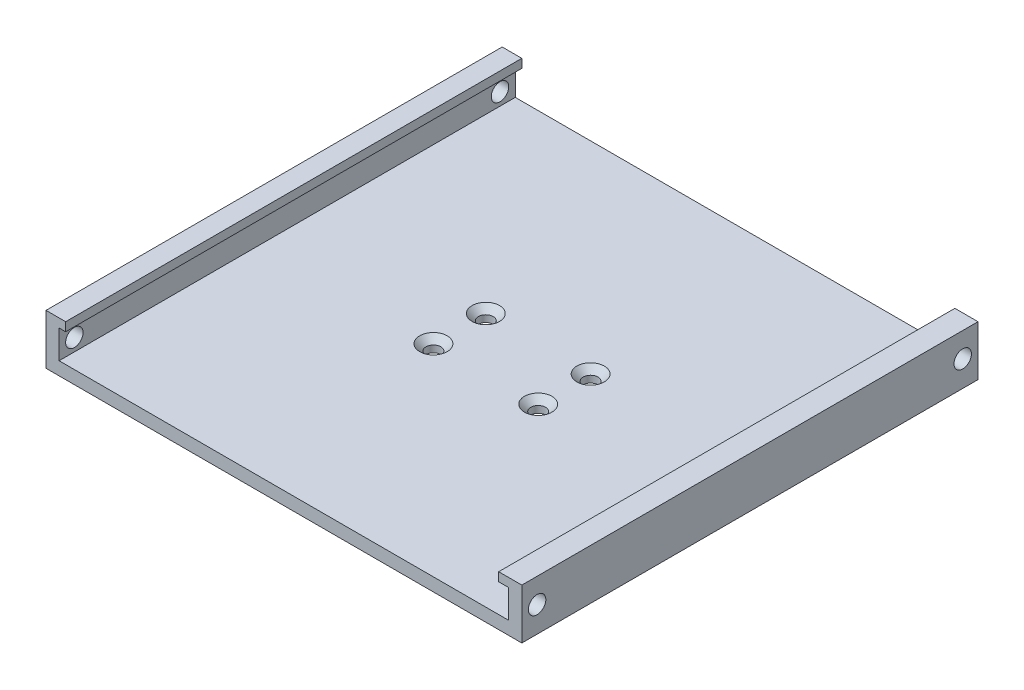
ISO-10303-21;
HEADER;
FILE_DESCRIPTION(('STEP AP214'),'2;1');
FILE_NAME('part.step','',(''),(''),'','','');
FILE_SCHEMA(('AUTOMOTIVE_DESIGN { 1 0 10303 214 1 1 1 1 }'));
ENDSEC;
DATA;
#1=APPLICATION_CONTEXT('core data for automotive mechanical design processes');
#2=APPLICATION_PROTOCOL_DEFINITION('international standard','automotive_design',2000,#1);
#3=PRODUCT_CONTEXT('',#1,'mechanical');
#4=PRODUCT('Part','Part','',(#3));
#5=PRODUCT_RELATED_PRODUCT_CATEGORY('part','',(#4));
#6=PRODUCT_DEFINITION_FORMATION('','',#4);
#7=PRODUCT_DEFINITION_CONTEXT('part definition',#1,'design');
#8=PRODUCT_DEFINITION('design','',#6,#7);
#9=PRODUCT_DEFINITION_SHAPE('','',#8);
#10=(LENGTH_UNIT() NAMED_UNIT(*) SI_UNIT(.MILLI.,.METRE.));
#11=(NAMED_UNIT(*) PLANE_ANGLE_UNIT() SI_UNIT($,.RADIAN.));
#12=(NAMED_UNIT(*) SI_UNIT($,.STERADIAN.) SOLID_ANGLE_UNIT());
#13=UNCERTAINTY_MEASURE_WITH_UNIT(LENGTH_MEASURE(1.E-05),#10,'distance_accuracy_value','');
#14=(GEOMETRIC_REPRESENTATION_CONTEXT(3) GLOBAL_UNCERTAINTY_ASSIGNED_CONTEXT((#13)) GLOBAL_UNIT_ASSIGNED_CONTEXT((#10,
#11,#12)) REPRESENTATION_CONTEXT('',''));
#15=CARTESIAN_POINT('',(0.,0.,0.));
#16=DIRECTION('',(0.,0.,1.));
#17=DIRECTION('',(1.,0.,0.));
#18=AXIS2_PLACEMENT_3D('',#15,#16,#17);
#19=CARTESIAN_POINT('',(-54.5,11.5,-52.25));
#20=DIRECTION('',(-1.,0.,0.));
#21=DIRECTION('',(0.,-1.,0.));
#22=AXIS2_PLACEMENT_3D('',#19,#20,#21);
#23=PLANE('',#22);
#24=CARTESIAN_POINT('',(-54.5,5.87500000000007,48.75));
#25=DIRECTION('',(1.,0.,0.));
#26=DIRECTION('',(0.,1.,0.));
#27=AXIS2_PLACEMENT_3D('',#24,#25,#26);
#28=CIRCLE('',#27,2.);
#29=CARTESIAN_POINT('',(-54.5,7.87500000000007,48.75));
#30=VERTEX_POINT('',#29);
#31=EDGE_CURVE('E359',#30,#30,#28,.T.);
#32=ORIENTED_EDGE('',*,*,#31,.T.);
#33=EDGE_LOOP('',(#32));
#34=FACE_BOUND('',#33,.T.);
#35=CARTESIAN_POINT('',(-54.5,5.87500000000041,-48.75));
#36=DIRECTION('',(1.,0.,0.));
#37=DIRECTION('',(0.,1.,0.));
#38=AXIS2_PLACEMENT_3D('',#35,#36,#37);
#39=CIRCLE('',#38,2.);
#40=CARTESIAN_POINT('',(-54.5,7.87500000000041,-48.75));
#41=VERTEX_POINT('',#40);
#42=EDGE_CURVE('E360',#41,#41,#39,.T.);
#43=ORIENTED_EDGE('',*,*,#42,.T.);
#44=EDGE_LOOP('',(#43));
#45=FACE_BOUND('',#44,.T.);
#46=DIRECTION('',(0.,0.,1.));
#47=VECTOR('',#46,1.);
#48=CARTESIAN_POINT('',(-54.5,0.,-52.25));
#49=LINE('',#48,#47);
#50=CARTESIAN_POINT('',(-54.5,0.,-52.25));
#51=VERTEX_POINT('',#50);
#52=CARTESIAN_POINT('',(-54.5,0.,52.25));
#53=VERTEX_POINT('',#52);
#54=EDGE_CURVE('E42',#51,#53,#49,.T.);
#55=ORIENTED_EDGE('',*,*,#54,.T.);
#56=DIRECTION('',(0.,-1.,0.));
#57=VECTOR('',#56,1.);
#58=CARTESIAN_POINT('',(-54.5,11.5,52.25));
#59=LINE('',#58,#57);
#60=CARTESIAN_POINT('',(-54.5,11.5,52.25));
#61=VERTEX_POINT('',#60);
#62=EDGE_CURVE('E127',#61,#53,#59,.T.);
#63=ORIENTED_EDGE('',*,*,#62,.F.);
#64=DIRECTION('',(0.,0.,1.));
#65=VECTOR('',#64,1.);
#66=CARTESIAN_POINT('',(-54.5,11.5,-52.25));
#67=LINE('',#66,#65);
#68=CARTESIAN_POINT('',(-54.5,11.5,-52.25));
#69=VERTEX_POINT('',#68);
#70=EDGE_CURVE('E11',#69,#61,#67,.T.);
#71=ORIENTED_EDGE('',*,*,#70,.F.);
#72=DIRECTION('',(0.,-1.,0.));
#73=VECTOR('',#72,1.);
#74=CARTESIAN_POINT('',(-54.5,11.5,-52.25));
#75=LINE('',#74,#73);
#76=EDGE_CURVE('E128',#69,#51,#75,.T.);
#77=ORIENTED_EDGE('',*,*,#76,.T.);
#78=EDGE_LOOP('',(#55,#63,#71,#77));
#79=FACE_BOUND('',#78,.T.);
#80=ADVANCED_FACE('F39',(#34,#45,#79),#23,.T.);
#81=CARTESIAN_POINT('',(-54.5,11.5,-52.25));
#82=DIRECTION('',(0.,1.,0.));
#83=DIRECTION('',(0.,0.,1.));
#84=AXIS2_PLACEMENT_3D('',#81,#82,#83);
#85=PLANE('',#84);
#86=ORIENTED_EDGE('',*,*,#70,.T.);
#87=DIRECTION('',(-1.,0.,0.));
#88=VECTOR('',#87,1.);
#89=CARTESIAN_POINT('',(-54.5,11.5,52.25));
#90=LINE('',#89,#88);
#91=CARTESIAN_POINT('',(-50.,11.5,52.25));
#92=VERTEX_POINT('',#91);
#93=EDGE_CURVE('E145',#92,#61,#90,.T.);
#94=ORIENTED_EDGE('',*,*,#93,.F.);
#95=DIRECTION('',(0.,0.,1.));
#96=VECTOR('',#95,1.);
#97=CARTESIAN_POINT('',(-50.,11.5,-52.25));
#98=LINE('',#97,#96);
#99=CARTESIAN_POINT('',(-50.,11.5,-52.25));
#100=VERTEX_POINT('',#99);
#101=EDGE_CURVE('E47',#100,#92,#98,.T.);
#102=ORIENTED_EDGE('',*,*,#101,.F.);
#103=DIRECTION('',(-1.,0.,0.));
#104=VECTOR('',#103,1.);
#105=CARTESIAN_POINT('',(-54.5,11.5,-52.25));
#106=LINE('',#105,#104);
#107=EDGE_CURVE('E133',#100,#69,#106,.T.);
#108=ORIENTED_EDGE('',*,*,#107,.T.);
#109=EDGE_LOOP('',(#86,#94,#102,#108));
#110=FACE_BOUND('',#109,.T.);
#111=ADVANCED_FACE('F262',(#110),#85,.T.);
#112=CARTESIAN_POINT('',(-50.,11.5,-52.25));
#113=DIRECTION('',(1.,0.,0.));
#114=DIRECTION('',(0.,0.,-1.));
#115=AXIS2_PLACEMENT_3D('',#112,#113,#114);
#116=PLANE('',#115);
#117=ORIENTED_EDGE('',*,*,#101,.T.);
#118=DIRECTION('',(0.,1.,0.));
#119=VECTOR('',#118,1.);
#120=CARTESIAN_POINT('',(-50.,11.5,52.25));
#121=LINE('',#120,#119);
#122=CARTESIAN_POINT('',(-50.,9.5,52.25));
#123=VERTEX_POINT('',#122);
#124=EDGE_CURVE('E175',#123,#92,#121,.T.);
#125=ORIENTED_EDGE('',*,*,#124,.F.);
#126=DIRECTION('',(0.,0.,1.));
#127=VECTOR('',#126,1.);
#128=CARTESIAN_POINT('',(-50.,9.5,-52.25));
#129=LINE('',#128,#127);
#130=CARTESIAN_POINT('',(-50.,9.5,-52.25));
#131=VERTEX_POINT('',#130);
#132=EDGE_CURVE('E209',#131,#123,#129,.T.);
#133=ORIENTED_EDGE('',*,*,#132,.F.);
#134=DIRECTION('',(0.,1.,0.));
#135=VECTOR('',#134,1.);
#136=CARTESIAN_POINT('',(-50.,11.5,-52.25));
#137=LINE('',#136,#135);
#138=EDGE_CURVE('E205',#131,#100,#137,.T.);
#139=ORIENTED_EDGE('',*,*,#138,.T.);
#140=EDGE_LOOP('',(#117,#125,#133,#139));
#141=FACE_BOUND('',#140,.T.);
#142=ADVANCED_FACE('F260',(#141),#116,.T.);
#143=CARTESIAN_POINT('',(-51.5,9.5,-52.25));
#144=DIRECTION('',(0.,-1.,0.));
#145=DIRECTION('',(0.,0.,-1.));
#146=AXIS2_PLACEMENT_3D('',#143,#144,#145);
#147=PLANE('',#146);
#148=ORIENTED_EDGE('',*,*,#132,.T.);
#149=DIRECTION('',(1.,0.,0.));
#150=VECTOR('',#149,1.);
#151=CARTESIAN_POINT('',(-51.5,9.5,52.25));
#152=LINE('',#151,#150);
#153=CARTESIAN_POINT('',(-51.5,9.5,52.25));
#154=VERTEX_POINT('',#153);
#155=EDGE_CURVE('E172',#154,#123,#152,.T.);
#156=ORIENTED_EDGE('',*,*,#155,.F.);
#157=DIRECTION('',(0.,0.,1.));
#158=VECTOR('',#157,1.);
#159=CARTESIAN_POINT('',(-51.5,9.5,-52.25));
#160=LINE('',#159,#158);
#161=CARTESIAN_POINT('',(-51.5,9.5,-52.25));
#162=VERTEX_POINT('',#161);
#163=EDGE_CURVE('E211',#162,#154,#160,.T.);
#164=ORIENTED_EDGE('',*,*,#163,.F.);
#165=DIRECTION('',(1.,0.,0.));
#166=VECTOR('',#165,1.);
#167=CARTESIAN_POINT('',(-51.5,9.5,-52.25));
#168=LINE('',#167,#166);
#169=EDGE_CURVE('E202',#162,#131,#168,.T.);
#170=ORIENTED_EDGE('',*,*,#169,.T.);
#171=EDGE_LOOP('',(#148,#156,#164,#170));
#172=FACE_BOUND('',#171,.T.);
#173=ADVANCED_FACE('F258',(#172),#147,.T.);
#174=CARTESIAN_POINT('',(-51.5,9.5,-52.25));
#175=DIRECTION('',(1.,0.,0.));
#176=DIRECTION('',(0.,0.,-1.));
#177=AXIS2_PLACEMENT_3D('',#174,#175,#176);
#178=PLANE('',#177);
#179=CARTESIAN_POINT('',(-51.5,5.87500000000007,48.75));
#180=DIRECTION('',(1.,0.,0.));
#181=DIRECTION('',(0.,0.,-1.));
#182=AXIS2_PLACEMENT_3D('',#179,#180,#181);
#183=CIRCLE('',#182,2.);
#184=CARTESIAN_POINT('',(-51.5,7.87500000000007,48.75));
#185=VERTEX_POINT('',#184);
#186=EDGE_CURVE('E347',#185,#185,#183,.T.);
#187=ORIENTED_EDGE('',*,*,#186,.F.);
#188=EDGE_LOOP('',(#187));
#189=FACE_BOUND('',#188,.T.);
#190=CARTESIAN_POINT('',(-51.5,5.87500000000041,-48.75));
#191=DIRECTION('',(1.,0.,0.));
#192=DIRECTION('',(0.,0.,-1.));
#193=AXIS2_PLACEMENT_3D('',#190,#191,#192);
#194=CIRCLE('',#193,2.);
#195=CARTESIAN_POINT('',(-51.5,7.87500000000041,-48.75));
#196=VERTEX_POINT('',#195);
#197=EDGE_CURVE('E353',#196,#196,#194,.T.);
#198=ORIENTED_EDGE('',*,*,#197,.F.);
#199=EDGE_LOOP('',(#198));
#200=FACE_BOUND('',#199,.T.);
#201=ORIENTED_EDGE('',*,*,#163,.T.);
#202=DIRECTION('',(0.,1.,0.));
#203=VECTOR('',#202,1.);
#204=CARTESIAN_POINT('',(-51.5,9.5,52.25));
#205=LINE('',#204,#203);
#206=CARTESIAN_POINT('',(-51.5,3.,52.25));
#207=VERTEX_POINT('',#206);
#208=EDGE_CURVE('E169',#207,#154,#205,.T.);
#209=ORIENTED_EDGE('',*,*,#208,.F.);
#210=DIRECTION('',(0.,0.,1.));
#211=VECTOR('',#210,1.);
#212=CARTESIAN_POINT('',(-51.5,3.,-52.25));
#213=LINE('',#212,#211);
#214=CARTESIAN_POINT('',(-51.5,3.,-52.25));
#215=VERTEX_POINT('',#214);
#216=EDGE_CURVE('E213',#215,#207,#213,.T.);
#217=ORIENTED_EDGE('',*,*,#216,.F.);
#218=DIRECTION('',(0.,1.,0.));
#219=VECTOR('',#218,1.);
#220=CARTESIAN_POINT('',(-51.5,9.5,-52.25));
#221=LINE('',#220,#219);
#222=EDGE_CURVE('E199',#215,#162,#221,.T.);
#223=ORIENTED_EDGE('',*,*,#222,.T.);
#224=EDGE_LOOP('',(#201,#209,#217,#223));
#225=FACE_BOUND('',#224,.T.);
#226=ADVANCED_FACE('F253',(#189,#200,#225),#178,.T.);
#227=CARTESIAN_POINT('',(-51.5,3.,-52.25));
#228=DIRECTION('',(0.,1.,0.));
#229=DIRECTION('',(0.,0.,1.));
#230=AXIS2_PLACEMENT_3D('',#227,#228,#229);
#231=PLANE('',#230);
#232=CARTESIAN_POINT('',(-12.,3.,-6.));
#233=DIRECTION('',(0.,1.,0.));
#234=DIRECTION('',(0.,0.,1.));
#235=AXIS2_PLACEMENT_3D('',#232,#233,#234);
#236=CIRCLE('',#235,3.15);
#237=CARTESIAN_POINT('',(-12.,3.,-2.85));
#238=VERTEX_POINT('',#237);
#239=EDGE_CURVE('E344',#238,#238,#236,.T.);
#240=ORIENTED_EDGE('',*,*,#239,.F.);
#241=EDGE_LOOP('',(#240));
#242=FACE_BOUND('',#241,.T.);
#243=CARTESIAN_POINT('',(-12.,3.,6.));
#244=DIRECTION('',(0.,1.,0.));
#245=DIRECTION('',(0.,0.,1.));
#246=AXIS2_PLACEMENT_3D('',#243,#244,#245);
#247=CIRCLE('',#246,3.15);
#248=CARTESIAN_POINT('',(-12.,3.,9.15));
#249=VERTEX_POINT('',#248);
#250=EDGE_CURVE('E337',#249,#249,#247,.T.);
#251=ORIENTED_EDGE('',*,*,#250,.F.);
#252=EDGE_LOOP('',(#251));
#253=FACE_BOUND('',#252,.T.);
#254=CARTESIAN_POINT('',(12.,3.,6.));
#255=DIRECTION('',(0.,1.,0.));
#256=DIRECTION('',(0.,0.,1.));
#257=AXIS2_PLACEMENT_3D('',#254,#255,#256);
#258=CIRCLE('',#257,3.15);
#259=CARTESIAN_POINT('',(12.,3.,9.15));
#260=VERTEX_POINT('',#259);
#261=EDGE_CURVE('E330',#260,#260,#258,.T.);
#262=ORIENTED_EDGE('',*,*,#261,.F.);
#263=EDGE_LOOP('',(#262));
#264=FACE_BOUND('',#263,.T.);
#265=CARTESIAN_POINT('',(12.,3.,-6.));
#266=DIRECTION('',(0.,1.,0.));
#267=DIRECTION('',(0.,0.,1.));
#268=AXIS2_PLACEMENT_3D('',#265,#266,#267);
#269=CIRCLE('',#268,3.15);
#270=CARTESIAN_POINT('',(12.,3.,-2.85));
#271=VERTEX_POINT('',#270);
#272=EDGE_CURVE('E322',#271,#271,#269,.T.);
#273=ORIENTED_EDGE('',*,*,#272,.F.);
#274=EDGE_LOOP('',(#273));
#275=FACE_BOUND('',#274,.T.);
#276=ORIENTED_EDGE('',*,*,#216,.T.);
#277=DIRECTION('',(-1.,0.,0.));
#278=VECTOR('',#277,1.);
#279=CARTESIAN_POINT('',(-51.5,3.,52.25));
#280=LINE('',#279,#278);
#281=CARTESIAN_POINT('',(51.5,3.,52.25));
#282=VERTEX_POINT('',#281);
#283=EDGE_CURVE('E166',#282,#207,#280,.T.);
#284=ORIENTED_EDGE('',*,*,#283,.F.);
#285=DIRECTION('',(0.,0.,1.));
#286=VECTOR('',#285,1.);
#287=CARTESIAN_POINT('',(51.5,3.,-52.25));
#288=LINE('',#287,#286);
#289=CARTESIAN_POINT('',(51.5,3.,-52.25));
#290=VERTEX_POINT('',#289);
#291=EDGE_CURVE('E215',#290,#282,#288,.T.);
#292=ORIENTED_EDGE('',*,*,#291,.F.);
#293=DIRECTION('',(-1.,0.,0.));
#294=VECTOR('',#293,1.);
#295=CARTESIAN_POINT('',(-51.5,3.,-52.25));
#296=LINE('',#295,#294);
#297=EDGE_CURVE('E196',#290,#215,#296,.T.);
#298=ORIENTED_EDGE('',*,*,#297,.T.);
#299=EDGE_LOOP('',(#276,#284,#292,#298));
#300=FACE_BOUND('',#299,.T.);
#301=ADVANCED_FACE('F248',(#242,#253,#264,#275,#300),#231,.T.);
#302=CARTESIAN_POINT('',(51.5,9.5,-52.25));
#303=DIRECTION('',(-1.,0.,0.));
#304=DIRECTION('',(0.,0.,1.));
#305=AXIS2_PLACEMENT_3D('',#302,#303,#304);
#306=PLANE('',#305);
#307=CARTESIAN_POINT('',(51.5,5.87500000000001,48.75));
#308=DIRECTION('',(-1.,0.,0.));
#309=DIRECTION('',(0.,0.,1.));
#310=AXIS2_PLACEMENT_3D('',#307,#308,#309);
#311=CIRCLE('',#310,2.);
#312=CARTESIAN_POINT('',(51.5,7.87500000000001,48.75));
#313=VERTEX_POINT('',#312);
#314=EDGE_CURVE('E350',#313,#313,#311,.T.);
#315=ORIENTED_EDGE('',*,*,#314,.F.);
#316=EDGE_LOOP('',(#315));
#317=FACE_BOUND('',#316,.T.);
#318=CARTESIAN_POINT('',(51.5,5.87500000000035,-48.75));
#319=DIRECTION('',(-1.,0.,0.));
#320=DIRECTION('',(0.,0.,1.));
#321=AXIS2_PLACEMENT_3D('',#318,#319,#320);
#322=CIRCLE('',#321,2.);
#323=CARTESIAN_POINT('',(51.5,7.87500000000035,-48.75));
#324=VERTEX_POINT('',#323);
#325=EDGE_CURVE('E356',#324,#324,#322,.T.);
#326=ORIENTED_EDGE('',*,*,#325,.F.);
#327=EDGE_LOOP('',(#326));
#328=FACE_BOUND('',#327,.T.);
#329=ORIENTED_EDGE('',*,*,#291,.T.);
#330=DIRECTION('',(0.,-1.,0.));
#331=VECTOR('',#330,1.);
#332=CARTESIAN_POINT('',(51.5,9.5,52.25));
#333=LINE('',#332,#331);
#334=CARTESIAN_POINT('',(51.5,9.5,52.25));
#335=VERTEX_POINT('',#334);
#336=EDGE_CURVE('E163',#335,#282,#333,.T.);
#337=ORIENTED_EDGE('',*,*,#336,.F.);
#338=DIRECTION('',(0.,0.,1.));
#339=VECTOR('',#338,1.);
#340=CARTESIAN_POINT('',(51.5,9.5,-52.25));
#341=LINE('',#340,#339);
#342=CARTESIAN_POINT('',(51.5,9.5,-52.25));
#343=VERTEX_POINT('',#342);
#344=EDGE_CURVE('E217',#343,#335,#341,.T.);
#345=ORIENTED_EDGE('',*,*,#344,.F.);
#346=DIRECTION('',(0.,-1.,0.));
#347=VECTOR('',#346,1.);
#348=CARTESIAN_POINT('',(51.5,9.5,-52.25));
#349=LINE('',#348,#347);
#350=EDGE_CURVE('E193',#343,#290,#349,.T.);
#351=ORIENTED_EDGE('',*,*,#350,.T.);
#352=EDGE_LOOP('',(#329,#337,#345,#351));
#353=FACE_BOUND('',#352,.T.);
#354=ADVANCED_FACE('F246',(#317,#328,#353),#306,.T.);
#355=CARTESIAN_POINT('',(49.2,9.5,-52.25));
#356=DIRECTION('',(0.,-1.,0.));
#357=DIRECTION('',(0.,0.,-1.));
#358=AXIS2_PLACEMENT_3D('',#355,#356,#357);
#359=PLANE('',#358);
#360=ORIENTED_EDGE('',*,*,#344,.T.);
#361=DIRECTION('',(1.,0.,0.));
#362=VECTOR('',#361,1.);
#363=CARTESIAN_POINT('',(49.2,9.5,52.25));
#364=LINE('',#363,#362);
#365=CARTESIAN_POINT('',(49.2,9.5,52.25));
#366=VERTEX_POINT('',#365);
#367=EDGE_CURVE('E160',#366,#335,#364,.T.);
#368=ORIENTED_EDGE('',*,*,#367,.F.);
#369=DIRECTION('',(0.,0.,1.));
#370=VECTOR('',#369,1.);
#371=CARTESIAN_POINT('',(49.2,9.5,-52.25));
#372=LINE('',#371,#370);
#373=CARTESIAN_POINT('',(49.2,9.5,-52.25));
#374=VERTEX_POINT('',#373);
#375=EDGE_CURVE('E219',#374,#366,#372,.T.);
#376=ORIENTED_EDGE('',*,*,#375,.F.);
#377=DIRECTION('',(1.,0.,0.));
#378=VECTOR('',#377,1.);
#379=CARTESIAN_POINT('',(49.2,9.5,-52.25));
#380=LINE('',#379,#378);
#381=EDGE_CURVE('E190',#374,#343,#380,.T.);
#382=ORIENTED_EDGE('',*,*,#381,.T.);
#383=EDGE_LOOP('',(#360,#368,#376,#382));
#384=FACE_BOUND('',#383,.T.);
#385=ADVANCED_FACE('F241',(#384),#359,.T.);
#386=CARTESIAN_POINT('',(49.2,11.5,-52.25));
#387=DIRECTION('',(-1.,0.,0.));
#388=DIRECTION('',(0.,-1.,0.));
#389=AXIS2_PLACEMENT_3D('',#386,#387,#388);
#390=PLANE('',#389);
#391=ORIENTED_EDGE('',*,*,#375,.T.);
#392=DIRECTION('',(0.,-1.,0.));
#393=VECTOR('',#392,1.);
#394=CARTESIAN_POINT('',(49.2,11.5,52.25));
#395=LINE('',#394,#393);
#396=CARTESIAN_POINT('',(49.2,11.5,52.25));
#397=VERTEX_POINT('',#396);
#398=EDGE_CURVE('E157',#397,#366,#395,.T.);
#399=ORIENTED_EDGE('',*,*,#398,.F.);
#400=DIRECTION('',(0.,0.,1.));
#401=VECTOR('',#400,1.);
#402=CARTESIAN_POINT('',(49.2,11.5,-52.25));
#403=LINE('',#402,#401);
#404=CARTESIAN_POINT('',(49.2,11.5,-52.25));
#405=VERTEX_POINT('',#404);
#406=EDGE_CURVE('E221',#405,#397,#403,.T.);
#407=ORIENTED_EDGE('',*,*,#406,.F.);
#408=DIRECTION('',(0.,-1.,0.));
#409=VECTOR('',#408,1.);
#410=CARTESIAN_POINT('',(49.2,11.5,-52.25));
#411=LINE('',#410,#409);
#412=EDGE_CURVE('E187',#405,#374,#411,.T.);
#413=ORIENTED_EDGE('',*,*,#412,.T.);
#414=EDGE_LOOP('',(#391,#399,#407,#413));
#415=FACE_BOUND('',#414,.T.);
#416=ADVANCED_FACE('F234',(#415),#390,.T.);
#417=CARTESIAN_POINT('',(49.2,11.5,-52.25));
#418=DIRECTION('',(0.,1.,0.));
#419=DIRECTION('',(0.,0.,1.));
#420=AXIS2_PLACEMENT_3D('',#417,#418,#419);
#421=PLANE('',#420);
#422=ORIENTED_EDGE('',*,*,#406,.T.);
#423=DIRECTION('',(-1.,0.,0.));
#424=VECTOR('',#423,1.);
#425=CARTESIAN_POINT('',(49.2,11.5,52.25));
#426=LINE('',#425,#424);
#427=CARTESIAN_POINT('',(54.5,11.5,52.25));
#428=VERTEX_POINT('',#427);
#429=EDGE_CURVE('E154',#428,#397,#426,.T.);
#430=ORIENTED_EDGE('',*,*,#429,.F.);
#431=DIRECTION('',(0.,0.,1.));
#432=VECTOR('',#431,1.);
#433=CARTESIAN_POINT('',(54.5,11.5,-52.25));
#434=LINE('',#433,#432);
#435=CARTESIAN_POINT('',(54.5,11.5,-52.25));
#436=VERTEX_POINT('',#435);
#437=EDGE_CURVE('E223',#436,#428,#434,.T.);
#438=ORIENTED_EDGE('',*,*,#437,.F.);
#439=DIRECTION('',(-1.,0.,0.));
#440=VECTOR('',#439,1.);
#441=CARTESIAN_POINT('',(49.2,11.5,-52.25));
#442=LINE('',#441,#440);
#443=EDGE_CURVE('E184',#436,#405,#442,.T.);
#444=ORIENTED_EDGE('',*,*,#443,.T.);
#445=EDGE_LOOP('',(#422,#430,#438,#444));
#446=FACE_BOUND('',#445,.T.);
#447=ADVANCED_FACE('F231',(#446),#421,.T.);
#448=CARTESIAN_POINT('',(54.5,11.5,-52.25));
#449=DIRECTION('',(1.,0.,0.));
#450=DIRECTION('',(0.,1.,0.));
#451=AXIS2_PLACEMENT_3D('',#448,#449,#450);
#452=PLANE('',#451);
#453=CARTESIAN_POINT('',(54.5,5.875,48.75));
#454=DIRECTION('',(1.,0.,0.));
#455=DIRECTION('',(0.,1.,0.));
#456=AXIS2_PLACEMENT_3D('',#453,#454,#455);
#457=CIRCLE('',#456,2.);
#458=CARTESIAN_POINT('',(54.5,7.87500000000001,48.75));
#459=VERTEX_POINT('',#458);
#460=EDGE_CURVE('E366',#459,#459,#457,.T.);
#461=ORIENTED_EDGE('',*,*,#460,.F.);
#462=EDGE_LOOP('',(#461));
#463=FACE_BOUND('',#462,.T.);
#464=CARTESIAN_POINT('',(54.5,5.87500000000035,-48.75));
#465=DIRECTION('',(1.,0.,0.));
#466=DIRECTION('',(0.,1.,0.));
#467=AXIS2_PLACEMENT_3D('',#464,#465,#466);
#468=CIRCLE('',#467,2.);
#469=CARTESIAN_POINT('',(54.5,7.87500000000035,-48.75));
#470=VERTEX_POINT('',#469);
#471=EDGE_CURVE('E363',#470,#470,#468,.T.);
#472=ORIENTED_EDGE('',*,*,#471,.F.);
#473=EDGE_LOOP('',(#472));
#474=FACE_BOUND('',#473,.T.);
#475=ORIENTED_EDGE('',*,*,#437,.T.);
#476=DIRECTION('',(0.,1.,0.));
#477=VECTOR('',#476,1.);
#478=CARTESIAN_POINT('',(54.5,11.5,52.25));
#479=LINE('',#478,#477);
#480=CARTESIAN_POINT('',(54.5,0.,52.25));
#481=VERTEX_POINT('',#480);
#482=EDGE_CURVE('E140',#481,#428,#479,.T.);
#483=ORIENTED_EDGE('',*,*,#482,.F.);
#484=DIRECTION('',(0.,0.,1.));
#485=VECTOR('',#484,1.);
#486=CARTESIAN_POINT('',(54.5,0.,-52.25));
#487=LINE('',#486,#485);
#488=CARTESIAN_POINT('',(54.5,0.,-52.25));
#489=VERTEX_POINT('',#488);
#490=EDGE_CURVE('E132',#489,#481,#487,.T.);
#491=ORIENTED_EDGE('',*,*,#490,.F.);
#492=DIRECTION('',(0.,1.,0.));
#493=VECTOR('',#492,1.);
#494=CARTESIAN_POINT('',(54.5,11.5,-52.25));
#495=LINE('',#494,#493);
#496=EDGE_CURVE('E181',#489,#436,#495,.T.);
#497=ORIENTED_EDGE('',*,*,#496,.T.);
#498=EDGE_LOOP('',(#475,#483,#491,#497));
#499=FACE_BOUND('',#498,.T.);
#500=ADVANCED_FACE('F225',(#463,#474,#499),#452,.T.);
#501=CARTESIAN_POINT('',(-54.5,0.,-52.25));
#502=DIRECTION('',(0.,-1.,0.));
#503=DIRECTION('',(0.,0.,-1.));
#504=AXIS2_PLACEMENT_3D('',#501,#502,#503);
#505=PLANE('',#504);
#506=CARTESIAN_POINT('',(-12.,0.,-6.));
#507=DIRECTION('',(0.,1.,0.));
#508=DIRECTION('',(0.,0.,1.));
#509=AXIS2_PLACEMENT_3D('',#506,#507,#508);
#510=CIRCLE('',#509,1.7);
#511=CARTESIAN_POINT('',(-12.,0.,-4.3));
#512=VERTEX_POINT('',#511);
#513=EDGE_CURVE('E303',#512,#512,#510,.T.);
#514=ORIENTED_EDGE('',*,*,#513,.T.);
#515=EDGE_LOOP('',(#514));
#516=FACE_BOUND('',#515,.T.);
#517=CARTESIAN_POINT('',(-12.,0.,6.));
#518=DIRECTION('',(0.,1.,0.));
#519=DIRECTION('',(0.,0.,1.));
#520=AXIS2_PLACEMENT_3D('',#517,#518,#519);
#521=CIRCLE('',#520,1.7);
#522=CARTESIAN_POINT('',(-12.,0.,7.7));
#523=VERTEX_POINT('',#522);
#524=EDGE_CURVE('E307',#523,#523,#521,.T.);
#525=ORIENTED_EDGE('',*,*,#524,.T.);
#526=EDGE_LOOP('',(#525));
#527=FACE_BOUND('',#526,.T.);
#528=CARTESIAN_POINT('',(12.,0.,6.));
#529=DIRECTION('',(0.,1.,0.));
#530=DIRECTION('',(0.,0.,1.));
#531=AXIS2_PLACEMENT_3D('',#528,#529,#530);
#532=CIRCLE('',#531,1.7);
#533=CARTESIAN_POINT('',(12.,0.,7.7));
#534=VERTEX_POINT('',#533);
#535=EDGE_CURVE('E311',#534,#534,#532,.T.);
#536=ORIENTED_EDGE('',*,*,#535,.T.);
#537=EDGE_LOOP('',(#536));
#538=FACE_BOUND('',#537,.T.);
#539=CARTESIAN_POINT('',(12.,0.,-6.));
#540=DIRECTION('',(0.,1.,0.));
#541=DIRECTION('',(0.,0.,1.));
#542=AXIS2_PLACEMENT_3D('',#539,#540,#541);
#543=CIRCLE('',#542,1.7);
#544=CARTESIAN_POINT('',(12.,0.,-4.3));
#545=VERTEX_POINT('',#544);
#546=EDGE_CURVE('E146',#545,#545,#543,.T.);
#547=ORIENTED_EDGE('',*,*,#546,.T.);
#548=EDGE_LOOP('',(#547));
#549=FACE_BOUND('',#548,.T.);
#550=ORIENTED_EDGE('',*,*,#490,.T.);
#551=DIRECTION('',(1.,0.,0.));
#552=VECTOR('',#551,1.);
#553=CARTESIAN_POINT('',(-54.5,0.,52.25));
#554=LINE('',#553,#552);
#555=EDGE_CURVE('E135',#53,#481,#554,.T.);
#556=ORIENTED_EDGE('',*,*,#555,.F.);
#557=ORIENTED_EDGE('',*,*,#54,.F.);
#558=DIRECTION('',(1.,0.,0.));
#559=VECTOR('',#558,1.);
#560=CARTESIAN_POINT('',(-54.5,0.,-52.25));
#561=LINE('',#560,#559);
#562=EDGE_CURVE('E179',#51,#489,#561,.T.);
#563=ORIENTED_EDGE('',*,*,#562,.T.);
#564=EDGE_LOOP('',(#550,#556,#557,#563));
#565=FACE_BOUND('',#564,.T.);
#566=ADVANCED_FACE('F136',(#516,#527,#538,#549,#565),#505,.T.);
#567=CARTESIAN_POINT('',(0.,0.,-52.25));
#568=DIRECTION('',(0.,0.,1.));
#569=DIRECTION('',(1.,0.,0.));
#570=AXIS2_PLACEMENT_3D('',#567,#568,#569);
#571=PLANE('',#570);
#572=ORIENTED_EDGE('',*,*,#76,.F.);
#573=ORIENTED_EDGE('',*,*,#107,.F.);
#574=ORIENTED_EDGE('',*,*,#138,.F.);
#575=ORIENTED_EDGE('',*,*,#169,.F.);
#576=ORIENTED_EDGE('',*,*,#222,.F.);
#577=ORIENTED_EDGE('',*,*,#297,.F.);
#578=ORIENTED_EDGE('',*,*,#350,.F.);
#579=ORIENTED_EDGE('',*,*,#381,.F.);
#580=ORIENTED_EDGE('',*,*,#412,.F.);
#581=ORIENTED_EDGE('',*,*,#443,.F.);
#582=ORIENTED_EDGE('',*,*,#496,.F.);
#583=ORIENTED_EDGE('',*,*,#562,.F.);
#584=EDGE_LOOP('',(#572,#573,#574,#575,#576,#577,#578,#579,#580,#581,#582,#583));
#585=FACE_BOUND('',#584,.T.);
#586=ADVANCED_FACE('F237',(#585),#571,.F.);
#587=CARTESIAN_POINT('',(0.,0.,52.25));
#588=DIRECTION('',(0.,0.,1.));
#589=DIRECTION('',(1.,0.,0.));
#590=AXIS2_PLACEMENT_3D('',#587,#588,#589);
#591=PLANE('',#590);
#592=ORIENTED_EDGE('',*,*,#62,.T.);
#593=ORIENTED_EDGE('',*,*,#555,.T.);
#594=ORIENTED_EDGE('',*,*,#482,.T.);
#595=ORIENTED_EDGE('',*,*,#429,.T.);
#596=ORIENTED_EDGE('',*,*,#398,.T.);
#597=ORIENTED_EDGE('',*,*,#367,.T.);
#598=ORIENTED_EDGE('',*,*,#336,.T.);
#599=ORIENTED_EDGE('',*,*,#283,.T.);
#600=ORIENTED_EDGE('',*,*,#208,.T.);
#601=ORIENTED_EDGE('',*,*,#155,.T.);
#602=ORIENTED_EDGE('',*,*,#124,.T.);
#603=ORIENTED_EDGE('',*,*,#93,.T.);
#604=EDGE_LOOP('',(#592,#593,#594,#595,#596,#597,#598,#599,#600,#601,#602,#603));
#605=FACE_BOUND('',#604,.T.);
#606=ADVANCED_FACE('F143',(#605),#591,.T.);
#607=CARTESIAN_POINT('',(12.,3.,-6.));
#608=DIRECTION('',(0.,1.,0.));
#609=DIRECTION('',(0.,0.,1.));
#610=AXIS2_PLACEMENT_3D('',#607,#608,#609);
#611=CYLINDRICAL_SURFACE('',#610,1.7);
#612=ORIENTED_EDGE('',*,*,#546,.F.);
#613=EDGE_LOOP('',(#612));
#614=FACE_BOUND('',#613,.T.);
#615=CARTESIAN_POINT('',(12.,1.55,-6.));
#616=DIRECTION('',(0.,1.,0.));
#617=DIRECTION('',(0.,0.,1.));
#618=AXIS2_PLACEMENT_3D('',#615,#616,#617);
#619=CIRCLE('',#618,1.7);
#620=CARTESIAN_POINT('',(12.,1.55,-4.3));
#621=VERTEX_POINT('',#620);
#622=EDGE_CURVE('E149',#621,#621,#619,.T.);
#623=ORIENTED_EDGE('',*,*,#622,.T.);
#624=EDGE_LOOP('',(#623));
#625=FACE_BOUND('',#624,.T.);
#626=ADVANCED_FACE('F314',(#614,#625),#611,.F.);
#627=CARTESIAN_POINT('',(12.,3.,-6.));
#628=DIRECTION('',(0.,1.,0.));
#629=DIRECTION('',(0.,0.,1.));
#630=AXIS2_PLACEMENT_3D('',#627,#628,#629);
#631=CONICAL_SURFACE('',#630,3.15,0.785398163397448);
#632=ORIENTED_EDGE('',*,*,#622,.F.);
#633=EDGE_LOOP('',(#632));
#634=FACE_BOUND('',#633,.T.);
#635=ORIENTED_EDGE('',*,*,#272,.T.);
#636=EDGE_LOOP('',(#635));
#637=FACE_BOUND('',#636,.T.);
#638=ADVANCED_FACE('F317',(#634,#637),#631,.F.);
#639=CARTESIAN_POINT('',(12.,3.,6.));
#640=DIRECTION('',(0.,1.,0.));
#641=DIRECTION('',(0.,0.,1.));
#642=AXIS2_PLACEMENT_3D('',#639,#640,#641);
#643=CYLINDRICAL_SURFACE('',#642,1.7);
#644=ORIENTED_EDGE('',*,*,#535,.F.);
#645=EDGE_LOOP('',(#644));
#646=FACE_BOUND('',#645,.T.);
#647=CARTESIAN_POINT('',(12.,1.55,6.));
#648=DIRECTION('',(0.,1.,0.));
#649=DIRECTION('',(0.,0.,1.));
#650=AXIS2_PLACEMENT_3D('',#647,#648,#649);
#651=CIRCLE('',#650,1.7);
#652=CARTESIAN_POINT('',(12.,1.55,7.7));
#653=VERTEX_POINT('',#652);
#654=EDGE_CURVE('E327',#653,#653,#651,.T.);
#655=ORIENTED_EDGE('',*,*,#654,.T.);
#656=EDGE_LOOP('',(#655));
#657=FACE_BOUND('',#656,.T.);
#658=ADVANCED_FACE('F421',(#646,#657),#643,.F.);
#659=CARTESIAN_POINT('',(12.,3.,6.));
#660=DIRECTION('',(0.,1.,0.));
#661=DIRECTION('',(0.,0.,1.));
#662=AXIS2_PLACEMENT_3D('',#659,#660,#661);
#663=CONICAL_SURFACE('',#662,3.15,0.785398163397448);
#664=ORIENTED_EDGE('',*,*,#654,.F.);
#665=EDGE_LOOP('',(#664));
#666=FACE_BOUND('',#665,.T.);
#667=ORIENTED_EDGE('',*,*,#261,.T.);
#668=EDGE_LOOP('',(#667));
#669=FACE_BOUND('',#668,.T.);
#670=ADVANCED_FACE('F417',(#666,#669),#663,.F.);
#671=CARTESIAN_POINT('',(-12.,3.,6.));
#672=DIRECTION('',(0.,1.,0.));
#673=DIRECTION('',(0.,0.,1.));
#674=AXIS2_PLACEMENT_3D('',#671,#672,#673);
#675=CYLINDRICAL_SURFACE('',#674,1.7);
#676=ORIENTED_EDGE('',*,*,#524,.F.);
#677=EDGE_LOOP('',(#676));
#678=FACE_BOUND('',#677,.T.);
#679=CARTESIAN_POINT('',(-12.,1.55,6.));
#680=DIRECTION('',(0.,1.,0.));
#681=DIRECTION('',(0.,0.,1.));
#682=AXIS2_PLACEMENT_3D('',#679,#680,#681);
#683=CIRCLE('',#682,1.7);
#684=CARTESIAN_POINT('',(-12.,1.55,7.7));
#685=VERTEX_POINT('',#684);
#686=EDGE_CURVE('E334',#685,#685,#683,.T.);
#687=ORIENTED_EDGE('',*,*,#686,.T.);
#688=EDGE_LOOP('',(#687));
#689=FACE_BOUND('',#688,.T.);
#690=ADVANCED_FACE('F413',(#678,#689),#675,.F.);
#691=CARTESIAN_POINT('',(-12.,3.,6.));
#692=DIRECTION('',(0.,1.,0.));
#693=DIRECTION('',(0.,0.,1.));
#694=AXIS2_PLACEMENT_3D('',#691,#692,#693);
#695=CONICAL_SURFACE('',#694,3.15,0.785398163397448);
#696=ORIENTED_EDGE('',*,*,#686,.F.);
#697=EDGE_LOOP('',(#696));
#698=FACE_BOUND('',#697,.T.);
#699=ORIENTED_EDGE('',*,*,#250,.T.);
#700=EDGE_LOOP('',(#699));
#701=FACE_BOUND('',#700,.T.);
#702=ADVANCED_FACE('F409',(#698,#701),#695,.F.);
#703=CARTESIAN_POINT('',(-12.,3.,-6.));
#704=DIRECTION('',(0.,1.,0.));
#705=DIRECTION('',(0.,0.,1.));
#706=AXIS2_PLACEMENT_3D('',#703,#704,#705);
#707=CYLINDRICAL_SURFACE('',#706,1.7);
#708=ORIENTED_EDGE('',*,*,#513,.F.);
#709=EDGE_LOOP('',(#708));
#710=FACE_BOUND('',#709,.T.);
#711=CARTESIAN_POINT('',(-12.,1.55,-6.));
#712=DIRECTION('',(0.,1.,0.));
#713=DIRECTION('',(0.,0.,1.));
#714=AXIS2_PLACEMENT_3D('',#711,#712,#713);
#715=CIRCLE('',#714,1.7);
#716=CARTESIAN_POINT('',(-12.,1.55,-4.3));
#717=VERTEX_POINT('',#716);
#718=EDGE_CURVE('E341',#717,#717,#715,.T.);
#719=ORIENTED_EDGE('',*,*,#718,.T.);
#720=EDGE_LOOP('',(#719));
#721=FACE_BOUND('',#720,.T.);
#722=ADVANCED_FACE('F403',(#710,#721),#707,.F.);
#723=CARTESIAN_POINT('',(-12.,3.,-6.));
#724=DIRECTION('',(0.,1.,0.));
#725=DIRECTION('',(0.,0.,1.));
#726=AXIS2_PLACEMENT_3D('',#723,#724,#725);
#727=CONICAL_SURFACE('',#726,3.15,0.785398163397448);
#728=ORIENTED_EDGE('',*,*,#718,.F.);
#729=EDGE_LOOP('',(#728));
#730=FACE_BOUND('',#729,.T.);
#731=ORIENTED_EDGE('',*,*,#239,.T.);
#732=EDGE_LOOP('',(#731));
#733=FACE_BOUND('',#732,.T.);
#734=ADVANCED_FACE('F390',(#730,#733),#727,.F.);
#735=CARTESIAN_POINT('',(-54.5,5.87500000000041,-48.75));
#736=DIRECTION('',(1.,0.,0.));
#737=DIRECTION('',(0.,1.,0.));
#738=AXIS2_PLACEMENT_3D('',#735,#736,#737);
#739=CYLINDRICAL_SURFACE('',#738,2.);
#740=CARTESIAN_POINT('',(51.5,7.87500000000035,-48.75));
#741=CARTESIAN_POINT('',(51.53125,7.87500000000035,-48.75));
#742=CARTESIAN_POINT('',(51.5625,7.87500000000035,-48.75));
#743=CARTESIAN_POINT('',(51.625,7.87500000000035,-48.75));
#744=CARTESIAN_POINT('',(51.65625,7.87500000000035,-48.75));
#745=CARTESIAN_POINT('',(51.71875,7.87500000000035,-48.75));
#746=CARTESIAN_POINT('',(51.75,7.87500000000035,-48.75));
#747=CARTESIAN_POINT('',(51.8125,7.87500000000035,-48.75));
#748=CARTESIAN_POINT('',(51.84375,7.87500000000035,-48.75));
#749=CARTESIAN_POINT('',(51.90625,7.87500000000035,-48.75));
#750=CARTESIAN_POINT('',(51.9375,7.87500000000035,-48.75));
#751=CARTESIAN_POINT('',(52.,7.87500000000035,-48.75));
#752=CARTESIAN_POINT('',(52.03125,7.87500000000035,-48.75));
#753=CARTESIAN_POINT('',(52.09375,7.87500000000035,-48.75));
#754=CARTESIAN_POINT('',(52.125,7.87500000000035,-48.75));
#755=CARTESIAN_POINT('',(52.1875,7.87500000000035,-48.75));
#756=CARTESIAN_POINT('',(52.21875,7.87500000000035,-48.75));
#757=CARTESIAN_POINT('',(52.28125,7.87500000000035,-48.75));
#758=CARTESIAN_POINT('',(52.3125,7.87500000000035,-48.75));
#759=CARTESIAN_POINT('',(52.375,7.87500000000035,-48.75));
#760=CARTESIAN_POINT('',(52.40625,7.87500000000035,-48.75));
#761=CARTESIAN_POINT('',(52.46875,7.87500000000035,-48.75));
#762=CARTESIAN_POINT('',(52.5,7.87500000000035,-48.75));
#763=CARTESIAN_POINT('',(52.5625,7.87500000000035,-48.75));
#764=CARTESIAN_POINT('',(52.59375,7.87500000000035,-48.75));
#765=CARTESIAN_POINT('',(52.65625,7.87500000000035,-48.75));
#766=CARTESIAN_POINT('',(52.6875,7.87500000000035,-48.75));
#767=CARTESIAN_POINT('',(52.75,7.87500000000035,-48.75));
#768=CARTESIAN_POINT('',(52.78125,7.87500000000035,-48.75));
#769=CARTESIAN_POINT('',(52.84375,7.87500000000035,-48.75));
#770=CARTESIAN_POINT('',(52.875,7.87500000000035,-48.75));
#771=CARTESIAN_POINT('',(52.9375,7.87500000000035,-48.75));
#772=CARTESIAN_POINT('',(52.96875,7.87500000000035,-48.75));
#773=CARTESIAN_POINT('',(53.03125,7.87500000000035,-48.75));
#774=CARTESIAN_POINT('',(53.0625,7.87500000000035,-48.75));
#775=CARTESIAN_POINT('',(53.125,7.87500000000035,-48.75));
#776=CARTESIAN_POINT('',(53.15625,7.87500000000035,-48.75));
#777=CARTESIAN_POINT('',(53.21875,7.87500000000035,-48.75));
#778=CARTESIAN_POINT('',(53.25,7.87500000000035,-48.75));
#779=CARTESIAN_POINT('',(53.3125,7.87500000000035,-48.75));
#780=CARTESIAN_POINT('',(53.34375,7.87500000000035,-48.75));
#781=CARTESIAN_POINT('',(53.40625,7.87500000000035,-48.75));
#782=CARTESIAN_POINT('',(53.4375,7.87500000000035,-48.75));
#783=CARTESIAN_POINT('',(53.5,7.87500000000035,-48.75));
#784=CARTESIAN_POINT('',(53.53125,7.87500000000035,-48.75));
#785=CARTESIAN_POINT('',(53.59375,7.87500000000035,-48.75));
#786=CARTESIAN_POINT('',(53.625,7.87500000000035,-48.75));
#787=CARTESIAN_POINT('',(53.6875,7.87500000000035,-48.75));
#788=CARTESIAN_POINT('',(53.71875,7.87500000000035,-48.75));
#789=CARTESIAN_POINT('',(53.78125,7.87500000000035,-48.75));
#790=CARTESIAN_POINT('',(53.8125,7.87500000000035,-48.75));
#791=CARTESIAN_POINT('',(53.875,7.87500000000035,-48.75));
#792=CARTESIAN_POINT('',(53.90625,7.87500000000035,-48.75));
#793=CARTESIAN_POINT('',(53.96875,7.87500000000035,-48.75));
#794=CARTESIAN_POINT('',(54.,7.87500000000035,-48.75));
#795=CARTESIAN_POINT('',(54.0625,7.87500000000035,-48.75));
#796=CARTESIAN_POINT('',(54.09375,7.87500000000035,-48.75));
#797=CARTESIAN_POINT('',(54.15625,7.87500000000035,-48.75));
#798=CARTESIAN_POINT('',(54.1875,7.87500000000035,-48.75));
#799=CARTESIAN_POINT('',(54.25,7.87500000000035,-48.75));
#800=CARTESIAN_POINT('',(54.28125,7.87500000000035,-48.75));
#801=CARTESIAN_POINT('',(54.34375,7.87500000000035,-48.75));
#802=CARTESIAN_POINT('',(54.375,7.87500000000035,-48.75));
#803=CARTESIAN_POINT('',(54.4375,7.87500000000035,-48.75));
#804=CARTESIAN_POINT('',(54.46875,7.87500000000035,-48.75));
#805=CARTESIAN_POINT('',(54.5,7.87500000000035,-48.75));
#806=B_SPLINE_CURVE_WITH_KNOTS('',3,(#740,#741,#742,#743,#744,#745,#746,#747,#748,#749,#750,
#751,#752,#753,#754,#755,#756,#757,#758,#759,#760,#761,#762,#763,#764,#765,#766,#767,#768,#769,
#770,#771,#772,#773,#774,#775,#776,#777,#778,#779,#780,#781,#782,#783,#784,#785,#786,#787,#788,
#789,#790,#791,#792,#793,#794,#795,#796,#797,#798,#799,#800,#801,#802,#803,#804,#805),
.UNSPECIFIED.,.F.,.F.,(4,2,2,2,2,2,2,2,2,2,2,2,2,2,2,2,2,2,2,2,2,2,2,2,2,2,2,2,2,2,2,2,4),(0.,
0.0937500000000036,0.187500000000007,0.281249999999997,0.375,0.468750000000004,
0.562499999999994,0.656249999999997,0.750000000000001,0.843750000000004,0.937500000000008,
1.03125,1.125,1.21875,1.31249999999999,1.40625,1.5,1.59375,1.68750000000001,1.78125,1.875,
1.96875000000001,2.06249999999999,2.15625,2.25,2.34375000000001,2.43750000000001,2.53125,2.625,
2.71875000000001,2.8125,2.90625,3.),.UNSPECIFIED.);
#807=EDGE_CURVE('BSEAM384',#324,#470,#806,.T.);
#808=ORIENTED_EDGE('',*,*,#325,.T.);
#809=ORIENTED_EDGE('',*,*,#471,.T.);
#810=ORIENTED_EDGE('',*,*,#807,.T.);
#811=ORIENTED_EDGE('',*,*,#807,.F.);
#812=EDGE_LOOP('',(#808,#810,#809,#811));
#813=FACE_BOUND('',#812,.T.);
#814=ADVANCED_FACE('F384',(#813),#739,.F.);
#815=CARTESIAN_POINT('',(-54.5,5.87500000000007,48.75));
#816=DIRECTION('',(1.,0.,0.));
#817=DIRECTION('',(0.,1.,0.));
#818=AXIS2_PLACEMENT_3D('',#815,#816,#817);
#819=CYLINDRICAL_SURFACE('',#818,2.);
#820=CARTESIAN_POINT('',(51.5,7.87500000000001,48.75));
#821=CARTESIAN_POINT('',(51.53125,7.87500000000001,48.75));
#822=CARTESIAN_POINT('',(51.5625,7.87500000000001,48.75));
#823=CARTESIAN_POINT('',(51.625,7.87500000000001,48.75));
#824=CARTESIAN_POINT('',(51.65625,7.87500000000001,48.75));
#825=CARTESIAN_POINT('',(51.71875,7.87500000000001,48.75));
#826=CARTESIAN_POINT('',(51.75,7.87500000000001,48.75));
#827=CARTESIAN_POINT('',(51.8125,7.87500000000001,48.75));
#828=CARTESIAN_POINT('',(51.84375,7.87500000000001,48.75));
#829=CARTESIAN_POINT('',(51.90625,7.87500000000001,48.75));
#830=CARTESIAN_POINT('',(51.9375,7.87500000000001,48.75));
#831=CARTESIAN_POINT('',(52.,7.87500000000001,48.75));
#832=CARTESIAN_POINT('',(52.03125,7.87500000000001,48.75));
#833=CARTESIAN_POINT('',(52.09375,7.87500000000001,48.75));
#834=CARTESIAN_POINT('',(52.125,7.87500000000001,48.75));
#835=CARTESIAN_POINT('',(52.1875,7.87500000000001,48.75));
#836=CARTESIAN_POINT('',(52.21875,7.87500000000001,48.75));
#837=CARTESIAN_POINT('',(52.28125,7.87500000000001,48.75));
#838=CARTESIAN_POINT('',(52.3125,7.87500000000001,48.75));
#839=CARTESIAN_POINT('',(52.375,7.87500000000001,48.75));
#840=CARTESIAN_POINT('',(52.40625,7.87500000000001,48.75));
#841=CARTESIAN_POINT('',(52.46875,7.87500000000001,48.75));
#842=CARTESIAN_POINT('',(52.5,7.87500000000001,48.75));
#843=CARTESIAN_POINT('',(52.5625,7.87500000000001,48.75));
#844=CARTESIAN_POINT('',(52.59375,7.87500000000001,48.75));
#845=CARTESIAN_POINT('',(52.65625,7.87500000000001,48.75));
#846=CARTESIAN_POINT('',(52.6875,7.87500000000001,48.75));
#847=CARTESIAN_POINT('',(52.75,7.87500000000001,48.75));
#848=CARTESIAN_POINT('',(52.78125,7.87500000000001,48.75));
#849=CARTESIAN_POINT('',(52.84375,7.87500000000001,48.75));
#850=CARTESIAN_POINT('',(52.875,7.87500000000001,48.75));
#851=CARTESIAN_POINT('',(52.9375,7.87500000000001,48.75));
#852=CARTESIAN_POINT('',(52.96875,7.87500000000001,48.75));
#853=CARTESIAN_POINT('',(53.03125,7.87500000000001,48.75));
#854=CARTESIAN_POINT('',(53.0625,7.87500000000001,48.75));
#855=CARTESIAN_POINT('',(53.125,7.87500000000001,48.75));
#856=CARTESIAN_POINT('',(53.15625,7.87500000000001,48.75));
#857=CARTESIAN_POINT('',(53.21875,7.87500000000001,48.75));
#858=CARTESIAN_POINT('',(53.25,7.87500000000001,48.75));
#859=CARTESIAN_POINT('',(53.3125,7.87500000000001,48.75));
#860=CARTESIAN_POINT('',(53.34375,7.87500000000001,48.75));
#861=CARTESIAN_POINT('',(53.40625,7.87500000000001,48.75));
#862=CARTESIAN_POINT('',(53.4375,7.87500000000001,48.75));
#863=CARTESIAN_POINT('',(53.5,7.87500000000001,48.75));
#864=CARTESIAN_POINT('',(53.53125,7.87500000000001,48.75));
#865=CARTESIAN_POINT('',(53.59375,7.87500000000001,48.75));
#866=CARTESIAN_POINT('',(53.625,7.87500000000001,48.75));
#867=CARTESIAN_POINT('',(53.6875,7.87500000000001,48.75));
#868=CARTESIAN_POINT('',(53.71875,7.87500000000001,48.75));
#869=CARTESIAN_POINT('',(53.78125,7.87500000000001,48.75));
#870=CARTESIAN_POINT('',(53.8125,7.87500000000001,48.75));
#871=CARTESIAN_POINT('',(53.875,7.87500000000001,48.75));
#872=CARTESIAN_POINT('',(53.90625,7.87500000000001,48.75));
#873=CARTESIAN_POINT('',(53.96875,7.87500000000001,48.75));
#874=CARTESIAN_POINT('',(54.,7.87500000000001,48.75));
#875=CARTESIAN_POINT('',(54.0625,7.87500000000001,48.75));
#876=CARTESIAN_POINT('',(54.09375,7.87500000000001,48.75));
#877=CARTESIAN_POINT('',(54.15625,7.87500000000001,48.75));
#878=CARTESIAN_POINT('',(54.1875,7.87500000000001,48.75));
#879=CARTESIAN_POINT('',(54.25,7.87500000000001,48.75));
#880=CARTESIAN_POINT('',(54.28125,7.87500000000001,48.75));
#881=CARTESIAN_POINT('',(54.34375,7.87500000000001,48.75));
#882=CARTESIAN_POINT('',(54.375,7.87500000000001,48.75));
#883=CARTESIAN_POINT('',(54.4375,7.87500000000001,48.75));
#884=CARTESIAN_POINT('',(54.46875,7.87500000000001,48.75));
#885=CARTESIAN_POINT('',(54.5,7.87500000000001,48.75));
#886=B_SPLINE_CURVE_WITH_KNOTS('',3,(#820,#821,#822,#823,#824,#825,#826,#827,#828,#829,#830,
#831,#832,#833,#834,#835,#836,#837,#838,#839,#840,#841,#842,#843,#844,#845,#846,#847,#848,#849,
#850,#851,#852,#853,#854,#855,#856,#857,#858,#859,#860,#861,#862,#863,#864,#865,#866,#867,#868,
#869,#870,#871,#872,#873,#874,#875,#876,#877,#878,#879,#880,#881,#882,#883,#884,#885),
.UNSPECIFIED.,.F.,.F.,(4,2,2,2,2,2,2,2,2,2,2,2,2,2,2,2,2,2,2,2,2,2,2,2,2,2,2,2,2,2,2,2,4),(0.,
0.0937500000000036,0.187500000000007,0.281249999999997,0.375,0.468750000000004,
0.562499999999994,0.656249999999997,0.750000000000001,0.843750000000004,0.937500000000008,
1.03125,1.125,1.21875,1.31249999999999,1.40625,1.5,1.59375,1.68750000000001,1.78125,1.875,
1.96875000000001,2.06249999999999,2.15625,2.25,2.34375000000001,2.43750000000001,2.53125,2.625,
2.71875000000001,2.8125,2.90625,3.),.UNSPECIFIED.);
#887=EDGE_CURVE('BSEAM378',#313,#459,#886,.T.);
#888=ORIENTED_EDGE('',*,*,#314,.T.);
#889=ORIENTED_EDGE('',*,*,#460,.T.);
#890=ORIENTED_EDGE('',*,*,#887,.T.);
#891=ORIENTED_EDGE('',*,*,#887,.F.);
#892=EDGE_LOOP('',(#888,#890,#889,#891));
#893=FACE_BOUND('',#892,.T.);
#894=ADVANCED_FACE('F378',(#893),#819,.F.);
#895=CARTESIAN_POINT('',(-51.5,7.87500000000041,-48.75));
#896=CARTESIAN_POINT('',(-51.53125,7.87500000000041,-48.75));
#897=CARTESIAN_POINT('',(-51.5625,7.87500000000041,-48.75));
#898=CARTESIAN_POINT('',(-51.625,7.87500000000041,-48.75));
#899=CARTESIAN_POINT('',(-51.65625,7.87500000000041,-48.75));
#900=CARTESIAN_POINT('',(-51.71875,7.87500000000041,-48.75));
#901=CARTESIAN_POINT('',(-51.75,7.87500000000041,-48.75));
#902=CARTESIAN_POINT('',(-51.8125,7.87500000000041,-48.75));
#903=CARTESIAN_POINT('',(-51.84375,7.87500000000041,-48.75));
#904=CARTESIAN_POINT('',(-51.90625,7.87500000000041,-48.75));
#905=CARTESIAN_POINT('',(-51.9375,7.87500000000041,-48.75));
#906=CARTESIAN_POINT('',(-52.,7.87500000000041,-48.75));
#907=CARTESIAN_POINT('',(-52.03125,7.87500000000041,-48.75));
#908=CARTESIAN_POINT('',(-52.09375,7.87500000000041,-48.75));
#909=CARTESIAN_POINT('',(-52.125,7.87500000000041,-48.75));
#910=CARTESIAN_POINT('',(-52.1875,7.87500000000041,-48.75));
#911=CARTESIAN_POINT('',(-52.21875,7.87500000000041,-48.75));
#912=CARTESIAN_POINT('',(-52.28125,7.87500000000041,-48.75));
#913=CARTESIAN_POINT('',(-52.3125,7.87500000000041,-48.75));
#914=CARTESIAN_POINT('',(-52.375,7.87500000000041,-48.75));
#915=CARTESIAN_POINT('',(-52.40625,7.87500000000041,-48.75));
#916=CARTESIAN_POINT('',(-52.46875,7.87500000000041,-48.75));
#917=CARTESIAN_POINT('',(-52.5,7.87500000000041,-48.75));
#918=CARTESIAN_POINT('',(-52.5625,7.87500000000041,-48.75));
#919=CARTESIAN_POINT('',(-52.59375,7.87500000000041,-48.75));
#920=CARTESIAN_POINT('',(-52.65625,7.87500000000041,-48.75));
#921=CARTESIAN_POINT('',(-52.6875,7.87500000000041,-48.75));
#922=CARTESIAN_POINT('',(-52.75,7.87500000000041,-48.75));
#923=CARTESIAN_POINT('',(-52.78125,7.87500000000041,-48.75));
#924=CARTESIAN_POINT('',(-52.84375,7.87500000000041,-48.75));
#925=CARTESIAN_POINT('',(-52.875,7.87500000000041,-48.75));
#926=CARTESIAN_POINT('',(-52.9375,7.87500000000041,-48.75));
#927=CARTESIAN_POINT('',(-52.96875,7.87500000000041,-48.75));
#928=CARTESIAN_POINT('',(-53.03125,7.87500000000041,-48.75));
#929=CARTESIAN_POINT('',(-53.0625,7.87500000000041,-48.75));
#930=CARTESIAN_POINT('',(-53.125,7.87500000000041,-48.75));
#931=CARTESIAN_POINT('',(-53.15625,7.87500000000041,-48.75));
#932=CARTESIAN_POINT('',(-53.21875,7.87500000000041,-48.75));
#933=CARTESIAN_POINT('',(-53.25,7.87500000000041,-48.75));
#934=CARTESIAN_POINT('',(-53.3125,7.87500000000041,-48.75));
#935=CARTESIAN_POINT('',(-53.34375,7.87500000000041,-48.75));
#936=CARTESIAN_POINT('',(-53.40625,7.87500000000041,-48.75));
#937=CARTESIAN_POINT('',(-53.4375,7.87500000000041,-48.75));
#938=CARTESIAN_POINT('',(-53.5,7.87500000000041,-48.75));
#939=CARTESIAN_POINT('',(-53.53125,7.87500000000041,-48.75));
#940=CARTESIAN_POINT('',(-53.59375,7.87500000000041,-48.75));
#941=CARTESIAN_POINT('',(-53.625,7.87500000000041,-48.75));
#942=CARTESIAN_POINT('',(-53.6875,7.87500000000041,-48.75));
#943=CARTESIAN_POINT('',(-53.71875,7.87500000000041,-48.75));
#944=CARTESIAN_POINT('',(-53.78125,7.87500000000041,-48.75));
#945=CARTESIAN_POINT('',(-53.8125,7.87500000000041,-48.75));
#946=CARTESIAN_POINT('',(-53.875,7.87500000000041,-48.75));
#947=CARTESIAN_POINT('',(-53.90625,7.87500000000041,-48.75));
#948=CARTESIAN_POINT('',(-53.96875,7.87500000000041,-48.75));
#949=CARTESIAN_POINT('',(-54.,7.87500000000041,-48.75));
#950=CARTESIAN_POINT('',(-54.0625,7.87500000000041,-48.75));
#951=CARTESIAN_POINT('',(-54.09375,7.87500000000041,-48.75));
#952=CARTESIAN_POINT('',(-54.15625,7.87500000000041,-48.75));
#953=CARTESIAN_POINT('',(-54.1875,7.87500000000041,-48.75));
#954=CARTESIAN_POINT('',(-54.25,7.87500000000041,-48.75));
#955=CARTESIAN_POINT('',(-54.28125,7.87500000000041,-48.75));
#956=CARTESIAN_POINT('',(-54.34375,7.87500000000041,-48.75));
#957=CARTESIAN_POINT('',(-54.375,7.87500000000041,-48.75));
#958=CARTESIAN_POINT('',(-54.4375,7.87500000000041,-48.75));
#959=CARTESIAN_POINT('',(-54.46875,7.87500000000041,-48.75));
#960=CARTESIAN_POINT('',(-54.5,7.87500000000041,-48.75));
#961=B_SPLINE_CURVE_WITH_KNOTS('',3,(#895,#896,#897,#898,#899,#900,#901,#902,#903,#904,#905,
#906,#907,#908,#909,#910,#911,#912,#913,#914,#915,#916,#917,#918,#919,#920,#921,#922,#923,#924,
#925,#926,#927,#928,#929,#930,#931,#932,#933,#934,#935,#936,#937,#938,#939,#940,#941,#942,#943,
#944,#945,#946,#947,#948,#949,#950,#951,#952,#953,#954,#955,#956,#957,#958,#959,#960),
.UNSPECIFIED.,.F.,.F.,(4,2,2,2,2,2,2,2,2,2,2,2,2,2,2,2,2,2,2,2,2,2,2,2,2,2,2,2,2,2,2,2,4),(0.,
0.0937500000000036,0.1875,0.281250000000004,0.375,0.468750000000004,0.5625,0.656250000000004,
0.750000000000001,0.843750000000004,0.937500000000001,1.03125,1.125,1.21875,1.3125,1.40625,1.5,
1.59375,1.6875,1.78125000000001,1.875,1.96875000000001,2.0625,2.15625000000001,2.25000000000001,
2.34375000000001,2.43750000000001,2.53125000000001,2.62500000000001,2.71875000000001,
2.81250000000001,2.90625000000001,3.00000000000001),.UNSPECIFIED.);
#962=EDGE_CURVE('BSEAM375',#196,#41,#961,.T.);
#963=ORIENTED_EDGE('',*,*,#197,.T.);
#964=ORIENTED_EDGE('',*,*,#42,.F.);
#965=ORIENTED_EDGE('',*,*,#962,.T.);
#966=ORIENTED_EDGE('',*,*,#962,.F.);
#967=EDGE_LOOP('',(#963,#965,#964,#966));
#968=FACE_BOUND('',#967,.T.);
#969=ADVANCED_FACE('F375',(#968),#739,.F.);
#970=CARTESIAN_POINT('',(-51.5,7.87500000000007,48.75));
#971=CARTESIAN_POINT('',(-51.53125,7.87500000000007,48.75));
#972=CARTESIAN_POINT('',(-51.5625,7.87500000000007,48.75));
#973=CARTESIAN_POINT('',(-51.625,7.87500000000007,48.75));
#974=CARTESIAN_POINT('',(-51.65625,7.87500000000007,48.75));
#975=CARTESIAN_POINT('',(-51.71875,7.87500000000007,48.75));
#976=CARTESIAN_POINT('',(-51.75,7.87500000000007,48.75));
#977=CARTESIAN_POINT('',(-51.8125,7.87500000000007,48.75));
#978=CARTESIAN_POINT('',(-51.84375,7.87500000000007,48.75));
#979=CARTESIAN_POINT('',(-51.90625,7.87500000000007,48.75));
#980=CARTESIAN_POINT('',(-51.9375,7.87500000000007,48.75));
#981=CARTESIAN_POINT('',(-52.,7.87500000000007,48.75));
#982=CARTESIAN_POINT('',(-52.03125,7.87500000000007,48.75));
#983=CARTESIAN_POINT('',(-52.09375,7.87500000000007,48.75));
#984=CARTESIAN_POINT('',(-52.125,7.87500000000007,48.75));
#985=CARTESIAN_POINT('',(-52.1875,7.87500000000007,48.75));
#986=CARTESIAN_POINT('',(-52.21875,7.87500000000007,48.75));
#987=CARTESIAN_POINT('',(-52.28125,7.87500000000007,48.75));
#988=CARTESIAN_POINT('',(-52.3125,7.87500000000007,48.75));
#989=CARTESIAN_POINT('',(-52.375,7.87500000000007,48.75));
#990=CARTESIAN_POINT('',(-52.40625,7.87500000000007,48.75));
#991=CARTESIAN_POINT('',(-52.46875,7.87500000000007,48.75));
#992=CARTESIAN_POINT('',(-52.5,7.87500000000007,48.75));
#993=CARTESIAN_POINT('',(-52.5625,7.87500000000007,48.75));
#994=CARTESIAN_POINT('',(-52.59375,7.87500000000007,48.75));
#995=CARTESIAN_POINT('',(-52.65625,7.87500000000007,48.75));
#996=CARTESIAN_POINT('',(-52.6875,7.87500000000007,48.75));
#997=CARTESIAN_POINT('',(-52.75,7.87500000000007,48.75));
#998=CARTESIAN_POINT('',(-52.78125,7.87500000000007,48.75));
#999=CARTESIAN_POINT('',(-52.84375,7.87500000000007,48.75));
#1000=CARTESIAN_POINT('',(-52.875,7.87500000000007,48.75));
#1001=CARTESIAN_POINT('',(-52.9375,7.87500000000007,48.75));
#1002=CARTESIAN_POINT('',(-52.96875,7.87500000000007,48.75));
#1003=CARTESIAN_POINT('',(-53.03125,7.87500000000007,48.75));
#1004=CARTESIAN_POINT('',(-53.0625,7.87500000000007,48.75));
#1005=CARTESIAN_POINT('',(-53.125,7.87500000000007,48.75));
#1006=CARTESIAN_POINT('',(-53.15625,7.87500000000007,48.75));
#1007=CARTESIAN_POINT('',(-53.21875,7.87500000000007,48.75));
#1008=CARTESIAN_POINT('',(-53.25,7.87500000000007,48.75));
#1009=CARTESIAN_POINT('',(-53.3125,7.87500000000007,48.75));
#1010=CARTESIAN_POINT('',(-53.34375,7.87500000000007,48.75));
#1011=CARTESIAN_POINT('',(-53.40625,7.87500000000007,48.75));
#1012=CARTESIAN_POINT('',(-53.4375,7.87500000000007,48.75));
#1013=CARTESIAN_POINT('',(-53.5,7.87500000000007,48.75));
#1014=CARTESIAN_POINT('',(-53.53125,7.87500000000007,48.75));
#1015=CARTESIAN_POINT('',(-53.59375,7.87500000000007,48.75));
#1016=CARTESIAN_POINT('',(-53.625,7.87500000000007,48.75));
#1017=CARTESIAN_POINT('',(-53.6875,7.87500000000007,48.75));
#1018=CARTESIAN_POINT('',(-53.71875,7.87500000000007,48.75));
#1019=CARTESIAN_POINT('',(-53.78125,7.87500000000007,48.75));
#1020=CARTESIAN_POINT('',(-53.8125,7.87500000000007,48.75));
#1021=CARTESIAN_POINT('',(-53.875,7.87500000000007,48.75));
#1022=CARTESIAN_POINT('',(-53.90625,7.87500000000007,48.75));
#1023=CARTESIAN_POINT('',(-53.96875,7.87500000000007,48.75));
#1024=CARTESIAN_POINT('',(-54.,7.87500000000007,48.75));
#1025=CARTESIAN_POINT('',(-54.0625,7.87500000000007,48.75));
#1026=CARTESIAN_POINT('',(-54.09375,7.87500000000007,48.75));
#1027=CARTESIAN_POINT('',(-54.15625,7.87500000000007,48.75));
#1028=CARTESIAN_POINT('',(-54.1875,7.87500000000007,48.75));
#1029=CARTESIAN_POINT('',(-54.25,7.87500000000007,48.75));
#1030=CARTESIAN_POINT('',(-54.28125,7.87500000000007,48.75));
#1031=CARTESIAN_POINT('',(-54.34375,7.87500000000007,48.75));
#1032=CARTESIAN_POINT('',(-54.375,7.87500000000007,48.75));
#1033=CARTESIAN_POINT('',(-54.4375,7.87500000000007,48.75));
#1034=CARTESIAN_POINT('',(-54.46875,7.87500000000007,48.75));
#1035=CARTESIAN_POINT('',(-54.5,7.87500000000007,48.75));
#1036=B_SPLINE_CURVE_WITH_KNOTS('',3,(#970,#971,#972,#973,#974,#975,#976,#977,#978,#979,#980,
#981,#982,#983,#984,#985,#986,#987,#988,#989,#990,#991,#992,#993,#994,#995,#996,#997,#998,#999,
#1000,#1001,#1002,#1003,#1004,#1005,#1006,#1007,#1008,#1009,#1010,#1011,#1012,#1013,#1014,#1015,
#1016,#1017,#1018,#1019,#1020,#1021,#1022,#1023,#1024,#1025,#1026,#1027,#1028,#1029,#1030,#1031,
#1032,#1033,#1034,#1035),.UNSPECIFIED.,.F.,.F.,(4,2,2,2,2,2,2,2,2,2,2,2,2,2,2,2,2,2,2,2,2,2,2,2,
2,2,2,2,2,2,2,2,4),(0.,0.0937500000000036,0.1875,0.281250000000004,0.375,0.468750000000004,
0.5625,0.656250000000004,0.750000000000001,0.843750000000004,0.937500000000001,1.03125,1.125,
1.21875,1.3125,1.40625,1.5,1.59375,1.6875,1.78125000000001,1.875,1.96875000000001,2.0625,
2.15625000000001,2.25000000000001,2.34375000000001,2.43750000000001,2.53125000000001,
2.62500000000001,2.71875000000001,2.81250000000001,2.90625000000001,3.00000000000001),.UNSPECIFIED.);
#1037=EDGE_CURVE('BSEAM373',#185,#30,#1036,.T.);
#1038=ORIENTED_EDGE('',*,*,#186,.T.);
#1039=ORIENTED_EDGE('',*,*,#31,.F.);
#1040=ORIENTED_EDGE('',*,*,#1037,.T.);
#1041=ORIENTED_EDGE('',*,*,#1037,.F.);
#1042=EDGE_LOOP('',(#1038,#1040,#1039,#1041));
#1043=FACE_BOUND('',#1042,.T.);
#1044=ADVANCED_FACE('F373',(#1043),#819,.F.);
#1045=CLOSED_SHELL('',(#80,#111,#142,#173,#226,#301,#354,#385,#416,#447,#500,#566,#586,#606,
#626,#638,#658,#670,#690,#702,#722,#734,#814,#894,#969,#1044));
#1046=MANIFOLD_SOLID_BREP('B2',#1045);
#1047=ADVANCED_BREP_SHAPE_REPRESENTATION('',(#18,#1046),#14);
#1048=SHAPE_DEFINITION_REPRESENTATION(#9,#1047);
ENDSEC;
END-ISO-10303-21;
